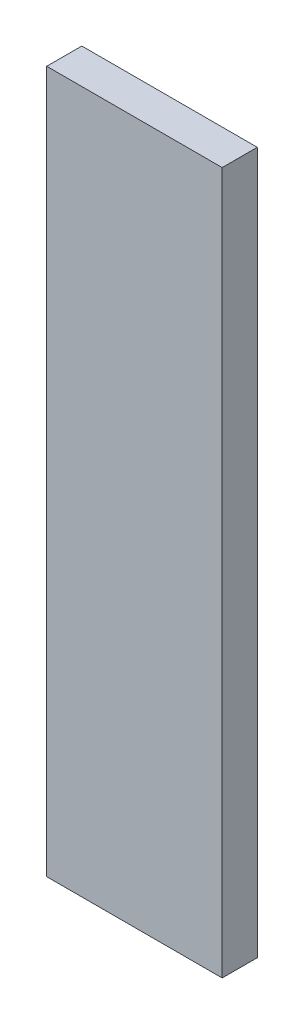
ISO-10303-21;
HEADER;
FILE_DESCRIPTION(('STEP AP214'),'2;1');
FILE_NAME('part.step','',(''),(''),'','','');
FILE_SCHEMA(('AUTOMOTIVE_DESIGN { 1 0 10303 214 1 1 1 1 }'));
ENDSEC;
DATA;
#1=APPLICATION_CONTEXT('core data for automotive mechanical design processes');
#2=APPLICATION_PROTOCOL_DEFINITION('international standard','automotive_design',2000,#1);
#3=PRODUCT_CONTEXT('',#1,'mechanical');
#4=PRODUCT('Part','Part','',(#3));
#5=PRODUCT_RELATED_PRODUCT_CATEGORY('part','',(#4));
#6=PRODUCT_DEFINITION_FORMATION('','',#4);
#7=PRODUCT_DEFINITION_CONTEXT('part definition',#1,'design');
#8=PRODUCT_DEFINITION('design','',#6,#7);
#9=PRODUCT_DEFINITION_SHAPE('','',#8);
#10=(LENGTH_UNIT() NAMED_UNIT(*) SI_UNIT(.MILLI.,.METRE.));
#11=(NAMED_UNIT(*) PLANE_ANGLE_UNIT() SI_UNIT($,.RADIAN.));
#12=(NAMED_UNIT(*) SI_UNIT($,.STERADIAN.) SOLID_ANGLE_UNIT());
#13=UNCERTAINTY_MEASURE_WITH_UNIT(LENGTH_MEASURE(1.E-05),#10,'distance_accuracy_value','');
#14=(GEOMETRIC_REPRESENTATION_CONTEXT(3) GLOBAL_UNCERTAINTY_ASSIGNED_CONTEXT((#13)) GLOBAL_UNIT_ASSIGNED_CONTEXT((#10,
#11,#12)) REPRESENTATION_CONTEXT('',''));
#15=CARTESIAN_POINT('',(0.,0.,0.));
#16=DIRECTION('',(0.,0.,1.));
#17=DIRECTION('',(1.,0.,0.));
#18=AXIS2_PLACEMENT_3D('',#15,#16,#17);
#19=CARTESIAN_POINT('',(0.,0.,6.));
#20=DIRECTION('',(1.,0.,0.));
#21=DIRECTION('',(0.,0.,-1.));
#22=AXIS2_PLACEMENT_3D('',#19,#20,#21);
#23=PLANE('',#22);
#24=DIRECTION('',(0.,-1.,0.));
#25=VECTOR('',#24,1.);
#26=CARTESIAN_POINT('',(0.,0.,0.));
#27=LINE('',#26,#25);
#28=CARTESIAN_POINT('',(0.,120.,0.));
#29=VERTEX_POINT('',#28);
#30=CARTESIAN_POINT('',(0.,0.,0.));
#31=VERTEX_POINT('',#30);
#32=EDGE_CURVE('E97',#29,#31,#27,.T.);
#33=ORIENTED_EDGE('',*,*,#32,.T.);
#34=DIRECTION('',(0.,0.,-1.));
#35=VECTOR('',#34,1.);
#36=CARTESIAN_POINT('',(0.,0.,6.));
#37=LINE('',#36,#35);
#38=CARTESIAN_POINT('',(0.,0.,6.));
#39=VERTEX_POINT('',#38);
#40=EDGE_CURVE('E11',#39,#31,#37,.T.);
#41=ORIENTED_EDGE('',*,*,#40,.F.);
#42=DIRECTION('',(0.,-1.,0.));
#43=VECTOR('',#42,1.);
#44=CARTESIAN_POINT('',(0.,0.,6.));
#45=LINE('',#44,#43);
#46=CARTESIAN_POINT('',(0.,120.,6.));
#47=VERTEX_POINT('',#46);
#48=EDGE_CURVE('E85',#47,#39,#45,.T.);
#49=ORIENTED_EDGE('',*,*,#48,.F.);
#50=DIRECTION('',(0.,0.,-1.));
#51=VECTOR('',#50,1.);
#52=CARTESIAN_POINT('',(0.,120.,6.));
#53=LINE('',#52,#51);
#54=EDGE_CURVE('E93',#47,#29,#53,.T.);
#55=ORIENTED_EDGE('',*,*,#54,.T.);
#56=EDGE_LOOP('',(#33,#41,#49,#55));
#57=FACE_BOUND('',#56,.T.);
#58=ADVANCED_FACE('F34',(#57),#23,.F.);
#59=CARTESIAN_POINT('',(0.,0.,6.));
#60=DIRECTION('',(0.,1.,0.));
#61=DIRECTION('',(0.,0.,1.));
#62=AXIS2_PLACEMENT_3D('',#59,#60,#61);
#63=PLANE('',#62);
#64=DIRECTION('',(1.,0.,0.));
#65=VECTOR('',#64,1.);
#66=CARTESIAN_POINT('',(0.,0.,0.));
#67=LINE('',#66,#65);
#68=CARTESIAN_POINT('',(30.,0.,0.));
#69=VERTEX_POINT('',#68);
#70=EDGE_CURVE('E89',#31,#69,#67,.T.);
#71=ORIENTED_EDGE('',*,*,#70,.T.);
#72=DIRECTION('',(0.,0.,-1.));
#73=VECTOR('',#72,1.);
#74=CARTESIAN_POINT('',(30.,0.,6.));
#75=LINE('',#74,#73);
#76=CARTESIAN_POINT('',(30.,0.,6.));
#77=VERTEX_POINT('',#76);
#78=EDGE_CURVE('E42',#77,#69,#75,.T.);
#79=ORIENTED_EDGE('',*,*,#78,.F.);
#80=DIRECTION('',(1.,0.,0.));
#81=VECTOR('',#80,1.);
#82=CARTESIAN_POINT('',(0.,0.,6.));
#83=LINE('',#82,#81);
#84=EDGE_CURVE('E80',#39,#77,#83,.T.);
#85=ORIENTED_EDGE('',*,*,#84,.F.);
#86=ORIENTED_EDGE('',*,*,#40,.T.);
#87=EDGE_LOOP('',(#71,#79,#85,#86));
#88=FACE_BOUND('',#87,.T.);
#89=ADVANCED_FACE('F88',(#88),#63,.F.);
#90=CARTESIAN_POINT('',(30.,0.,6.));
#91=DIRECTION('',(-1.,0.,0.));
#92=DIRECTION('',(0.,0.,1.));
#93=AXIS2_PLACEMENT_3D('',#90,#91,#92);
#94=PLANE('',#93);
#95=DIRECTION('',(0.,1.,0.));
#96=VECTOR('',#95,1.);
#97=CARTESIAN_POINT('',(30.,0.,0.));
#98=LINE('',#97,#96);
#99=CARTESIAN_POINT('',(30.,120.,0.));
#100=VERTEX_POINT('',#99);
#101=EDGE_CURVE('E67',#69,#100,#98,.T.);
#102=ORIENTED_EDGE('',*,*,#101,.T.);
#103=DIRECTION('',(0.,0.,-1.));
#104=VECTOR('',#103,1.);
#105=CARTESIAN_POINT('',(30.,120.,6.));
#106=LINE('',#105,#104);
#107=CARTESIAN_POINT('',(30.,120.,6.));
#108=VERTEX_POINT('',#107);
#109=EDGE_CURVE('E90',#108,#100,#106,.T.);
#110=ORIENTED_EDGE('',*,*,#109,.F.);
#111=DIRECTION('',(0.,1.,0.));
#112=VECTOR('',#111,1.);
#113=CARTESIAN_POINT('',(30.,0.,6.));
#114=LINE('',#113,#112);
#115=EDGE_CURVE('E83',#77,#108,#114,.T.);
#116=ORIENTED_EDGE('',*,*,#115,.F.);
#117=ORIENTED_EDGE('',*,*,#78,.T.);
#118=EDGE_LOOP('',(#102,#110,#116,#117));
#119=FACE_BOUND('',#118,.T.);
#120=ADVANCED_FACE('F91',(#119),#94,.F.);
#121=CARTESIAN_POINT('',(0.,120.,6.));
#122=DIRECTION('',(0.,-1.,0.));
#123=DIRECTION('',(0.,0.,-1.));
#124=AXIS2_PLACEMENT_3D('',#121,#122,#123);
#125=PLANE('',#124);
#126=DIRECTION('',(-1.,0.,0.));
#127=VECTOR('',#126,1.);
#128=CARTESIAN_POINT('',(0.,120.,0.));
#129=LINE('',#128,#127);
#130=EDGE_CURVE('E73',#100,#29,#129,.T.);
#131=ORIENTED_EDGE('',*,*,#130,.T.);
#132=ORIENTED_EDGE('',*,*,#54,.F.);
#133=DIRECTION('',(-1.,0.,0.));
#134=VECTOR('',#133,1.);
#135=CARTESIAN_POINT('',(0.,120.,6.));
#136=LINE('',#135,#134);
#137=EDGE_CURVE('E50',#108,#47,#136,.T.);
#138=ORIENTED_EDGE('',*,*,#137,.F.);
#139=ORIENTED_EDGE('',*,*,#109,.T.);
#140=EDGE_LOOP('',(#131,#132,#138,#139));
#141=FACE_BOUND('',#140,.T.);
#142=ADVANCED_FACE('F104',(#141),#125,.F.);
#143=CARTESIAN_POINT('',(0.,0.,6.));
#144=DIRECTION('',(0.,0.,-1.));
#145=DIRECTION('',(-1.,0.,0.));
#146=AXIS2_PLACEMENT_3D('',#143,#144,#145);
#147=PLANE('',#146);
#148=ORIENTED_EDGE('',*,*,#48,.T.);
#149=ORIENTED_EDGE('',*,*,#84,.T.);
#150=ORIENTED_EDGE('',*,*,#115,.T.);
#151=ORIENTED_EDGE('',*,*,#137,.T.);
#152=EDGE_LOOP('',(#148,#149,#150,#151));
#153=FACE_BOUND('',#152,.T.);
#154=ADVANCED_FACE('F81',(#153),#147,.F.);
#155=CARTESIAN_POINT('',(0.,0.,0.));
#156=DIRECTION('',(0.,0.,-1.));
#157=DIRECTION('',(-1.,0.,0.));
#158=AXIS2_PLACEMENT_3D('',#155,#156,#157);
#159=PLANE('',#158);
#160=ORIENTED_EDGE('',*,*,#32,.F.);
#161=ORIENTED_EDGE('',*,*,#130,.F.);
#162=ORIENTED_EDGE('',*,*,#101,.F.);
#163=ORIENTED_EDGE('',*,*,#70,.F.);
#164=EDGE_LOOP('',(#160,#161,#162,#163));
#165=FACE_BOUND('',#164,.T.);
#166=ADVANCED_FACE('F107',(#165),#159,.T.);
#167=CLOSED_SHELL('',(#58,#89,#120,#142,#154,#166));
#168=MANIFOLD_SOLID_BREP('B2',#167);
#169=ADVANCED_BREP_SHAPE_REPRESENTATION('',(#18,#168),#14);
#170=SHAPE_DEFINITION_REPRESENTATION(#9,#169);
ENDSEC;
END-ISO-10303-21;
